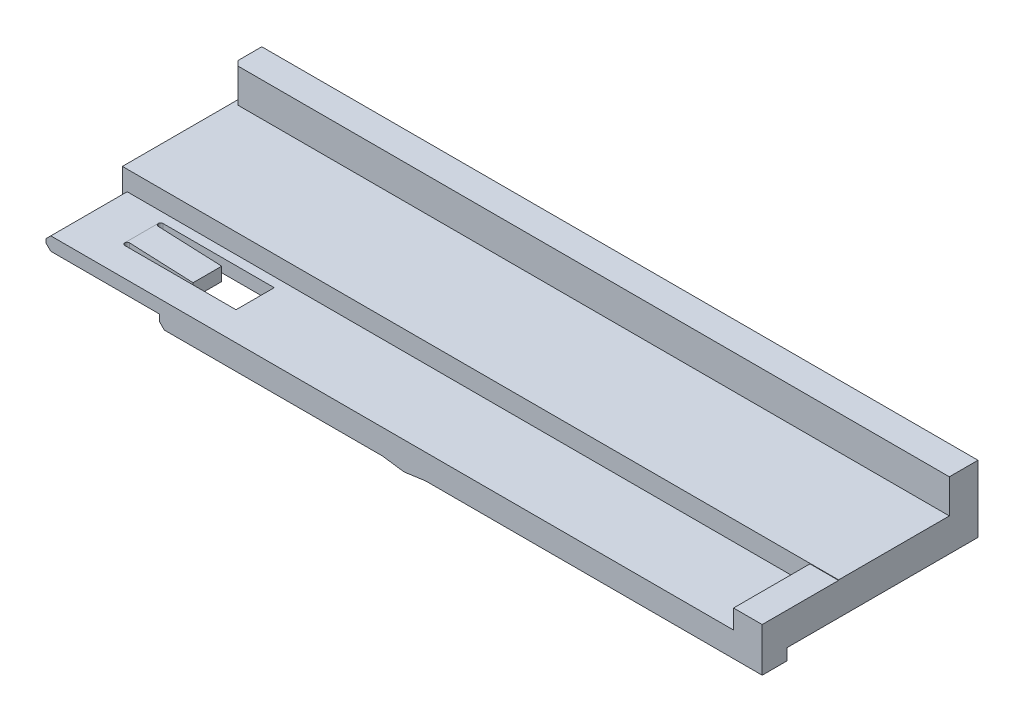
ISO-10303-21;
HEADER;
FILE_DESCRIPTION(('STEP AP214'),'2;1');
FILE_NAME('part.step','',(''),(''),'','','');
FILE_SCHEMA(('AUTOMOTIVE_DESIGN { 1 0 10303 214 1 1 1 1 }'));
ENDSEC;
DATA;
#1=APPLICATION_CONTEXT('core data for automotive mechanical design processes');
#2=APPLICATION_PROTOCOL_DEFINITION('international standard','automotive_design',2000,#1);
#3=PRODUCT_CONTEXT('',#1,'mechanical');
#4=PRODUCT('Part','Part','',(#3));
#5=PRODUCT_RELATED_PRODUCT_CATEGORY('part','',(#4));
#6=PRODUCT_DEFINITION_FORMATION('','',#4);
#7=PRODUCT_DEFINITION_CONTEXT('part definition',#1,'design');
#8=PRODUCT_DEFINITION('design','',#6,#7);
#9=PRODUCT_DEFINITION_SHAPE('','',#8);
#10=(LENGTH_UNIT() NAMED_UNIT(*) SI_UNIT(.MILLI.,.METRE.));
#11=(NAMED_UNIT(*) PLANE_ANGLE_UNIT() SI_UNIT($,.RADIAN.));
#12=(NAMED_UNIT(*) SI_UNIT($,.STERADIAN.) SOLID_ANGLE_UNIT());
#13=UNCERTAINTY_MEASURE_WITH_UNIT(LENGTH_MEASURE(1.E-05),#10,'distance_accuracy_value','');
#14=(GEOMETRIC_REPRESENTATION_CONTEXT(3) GLOBAL_UNCERTAINTY_ASSIGNED_CONTEXT((#13)) GLOBAL_UNIT_ASSIGNED_CONTEXT((#10,
#11,#12)) REPRESENTATION_CONTEXT('',''));
#15=CARTESIAN_POINT('',(0.,0.,0.));
#16=DIRECTION('',(0.,0.,1.));
#17=DIRECTION('',(1.,0.,0.));
#18=AXIS2_PLACEMENT_3D('',#15,#16,#17);
#19=CARTESIAN_POINT('',(75.,0.,-2.6));
#20=DIRECTION('',(0.,1.,0.));
#21=DIRECTION('',(0.,0.,1.));
#22=AXIS2_PLACEMENT_3D('',#19,#20,#21);
#23=PLANE('',#22);
#24=DIRECTION('',(-1.,0.,0.));
#25=VECTOR('',#24,1.);
#26=CARTESIAN_POINT('',(75.,0.,-2.6));
#27=LINE('',#26,#25);
#28=CARTESIAN_POINT('',(35.2653890832847,0.,-2.6));
#29=VERTEX_POINT('',#28);
#30=CARTESIAN_POINT('',(12.4,0.,-2.6));
#31=VERTEX_POINT('',#30);
#32=EDGE_CURVE('E375',#29,#31,#27,.T.);
#33=ORIENTED_EDGE('',*,*,#32,.F.);
#34=DIRECTION('',(0.,0.,1.));
#35=VECTOR('',#34,1.);
#36=CARTESIAN_POINT('',(35.2653890832847,0.,0.));
#37=LINE('',#36,#35);
#38=CARTESIAN_POINT('',(35.2653890832847,0.,0.));
#39=VERTEX_POINT('',#38);
#40=EDGE_CURVE('E290',#29,#39,#37,.T.);
#41=ORIENTED_EDGE('',*,*,#40,.T.);
#42=DIRECTION('',(-1.,0.,0.));
#43=VECTOR('',#42,1.);
#44=CARTESIAN_POINT('',(75.,0.,0.));
#45=LINE('',#44,#43);
#46=CARTESIAN_POINT('',(12.4,0.,0.));
#47=VERTEX_POINT('',#46);
#48=EDGE_CURVE('E401',#39,#47,#45,.T.);
#49=ORIENTED_EDGE('',*,*,#48,.T.);
#50=DIRECTION('',(0.,0.,-1.));
#51=VECTOR('',#50,1.);
#52=CARTESIAN_POINT('',(12.4,0.,-2.6));
#53=LINE('',#52,#51);
#54=EDGE_CURVE('E340',#47,#31,#53,.T.);
#55=ORIENTED_EDGE('',*,*,#54,.T.);
#56=EDGE_LOOP('',(#33,#41,#49,#55));
#57=FACE_BOUND('',#56,.T.);
#58=ADVANCED_FACE('F39',(#57),#23,.F.);
#59=CARTESIAN_POINT('',(75.,1.2,-2.6));
#60=DIRECTION('',(0.,0.,1.));
#61=DIRECTION('',(1.,0.,0.));
#62=AXIS2_PLACEMENT_3D('',#59,#60,#61);
#63=PLANE('',#62);
#64=DIRECTION('',(-1.,0.,0.));
#65=VECTOR('',#64,1.);
#66=CARTESIAN_POINT('',(75.,1.2,-2.6));
#67=LINE('',#66,#65);
#68=CARTESIAN_POINT('',(35.2653890832847,1.2,-2.6));
#69=VERTEX_POINT('',#68);
#70=CARTESIAN_POINT('',(11.9,1.2,-2.6));
#71=VERTEX_POINT('',#70);
#72=EDGE_CURVE('E378',#69,#71,#67,.T.);
#73=ORIENTED_EDGE('',*,*,#72,.F.);
#74=DIRECTION('',(0.,-1.,0.));
#75=VECTOR('',#74,1.);
#76=CARTESIAN_POINT('',(35.2653890832847,0.,-2.6));
#77=LINE('',#76,#75);
#78=EDGE_CURVE('E294',#69,#29,#77,.T.);
#79=ORIENTED_EDGE('',*,*,#78,.T.);
#80=ORIENTED_EDGE('',*,*,#32,.T.);
#81=DIRECTION('',(0.707106781186552,-0.707106781186543,0.));
#82=VECTOR('',#81,1.);
#83=CARTESIAN_POINT('',(11.9,0.499999999999994,-2.6));
#84=LINE('',#83,#82);
#85=CARTESIAN_POINT('',(11.9,0.499999999999994,-2.6));
#86=VERTEX_POINT('',#85);
#87=EDGE_CURVE('E338',#31,#86,#84,.F.);
#88=ORIENTED_EDGE('',*,*,#87,.T.);
#89=DIRECTION('',(0.,1.,0.));
#90=VECTOR('',#89,1.);
#91=CARTESIAN_POINT('',(11.9,1.2,-2.6));
#92=LINE('',#91,#90);
#93=EDGE_CURVE('E487',#86,#71,#92,.T.);
#94=ORIENTED_EDGE('',*,*,#93,.T.);
#95=EDGE_LOOP('',(#73,#79,#80,#88,#94));
#96=FACE_BOUND('',#95,.T.);
#97=ADVANCED_FACE('F539',(#96),#63,.F.);
#98=CARTESIAN_POINT('',(75.,2.6,0.));
#99=DIRECTION('',(0.,-1.,0.));
#100=DIRECTION('',(0.,0.,-1.));
#101=AXIS2_PLACEMENT_3D('',#98,#99,#100);
#102=PLANE('',#101);
#103=DIRECTION('',(0.,0.,-1.));
#104=VECTOR('',#103,1.);
#105=CARTESIAN_POINT('',(5.,2.6,-3.5));
#106=LINE('',#105,#104);
#107=CARTESIAN_POINT('',(5.,2.6,-3.25));
#108=VERTEX_POINT('',#107);
#109=CARTESIAN_POINT('',(5.,2.6,-6.75));
#110=VERTEX_POINT('',#109);
#111=EDGE_CURVE('E462',#108,#110,#106,.T.);
#112=ORIENTED_EDGE('',*,*,#111,.T.);
#113=CARTESIAN_POINT('',(5.25,2.6,-6.75));
#114=DIRECTION('',(0.,-1.,0.));
#115=DIRECTION('',(0.,0.,-1.));
#116=AXIS2_PLACEMENT_3D('',#113,#114,#115);
#117=CIRCLE('',#116,0.25);
#118=CARTESIAN_POINT('',(5.25,2.6,-7.));
#119=VERTEX_POINT('',#118);
#120=EDGE_CURVE('E321',#110,#119,#117,.T.);
#121=ORIENTED_EDGE('',*,*,#120,.T.);
#122=DIRECTION('',(1.,0.,0.));
#123=VECTOR('',#122,1.);
#124=CARTESIAN_POINT('',(5.,2.6,-7.));
#125=LINE('',#124,#123);
#126=CARTESIAN_POINT('',(16.9,2.6,-7.));
#127=VERTEX_POINT('',#126);
#128=EDGE_CURVE('E452',#119,#127,#125,.T.);
#129=ORIENTED_EDGE('',*,*,#128,.T.);
#130=DIRECTION('',(0.,0.,1.));
#131=VECTOR('',#130,1.);
#132=CARTESIAN_POINT('',(16.9,2.6,-7.));
#133=LINE('',#132,#131);
#134=CARTESIAN_POINT('',(16.9,2.6,-3.));
#135=VERTEX_POINT('',#134);
#136=EDGE_CURVE('E449',#127,#135,#133,.T.);
#137=ORIENTED_EDGE('',*,*,#136,.T.);
#138=DIRECTION('',(1.,0.,0.));
#139=VECTOR('',#138,1.);
#140=CARTESIAN_POINT('',(5.,2.6,-3.));
#141=LINE('',#140,#139);
#142=CARTESIAN_POINT('',(5.25,2.6,-3.));
#143=VERTEX_POINT('',#142);
#144=EDGE_CURVE('E447',#143,#135,#141,.T.);
#145=ORIENTED_EDGE('',*,*,#144,.F.);
#146=CARTESIAN_POINT('',(5.25,2.6,-3.25));
#147=DIRECTION('',(0.,-1.,0.));
#148=DIRECTION('',(0.,0.,-1.));
#149=AXIS2_PLACEMENT_3D('',#146,#147,#148);
#150=CIRCLE('',#149,0.25);
#151=EDGE_CURVE('E310',#143,#108,#150,.T.);
#152=ORIENTED_EDGE('',*,*,#151,.T.);
#153=EDGE_LOOP('',(#112,#121,#129,#137,#145,#152));
#154=FACE_BOUND('',#153,.T.);
#155=DIRECTION('',(-1.,0.,0.));
#156=VECTOR('',#155,1.);
#157=CARTESIAN_POINT('',(75.,2.6,-8.));
#158=LINE('',#157,#156);
#159=CARTESIAN_POINT('',(72.,2.6,-8.));
#160=VERTEX_POINT('',#159);
#161=CARTESIAN_POINT('',(0.499999999999987,2.6,-8.));
#162=VERTEX_POINT('',#161);
#163=EDGE_CURVE('E394',#160,#162,#158,.T.);
#164=ORIENTED_EDGE('',*,*,#163,.T.);
#165=DIRECTION('',(0.,0.,1.));
#166=VECTOR('',#165,1.);
#167=CARTESIAN_POINT('',(0.499999999999987,2.6,0.));
#168=LINE('',#167,#166);
#169=CARTESIAN_POINT('',(0.499999999999987,2.6,0.));
#170=VERTEX_POINT('',#169);
#171=EDGE_CURVE('E358',#162,#170,#168,.T.);
#172=ORIENTED_EDGE('',*,*,#171,.T.);
#173=DIRECTION('',(-1.,0.,0.));
#174=VECTOR('',#173,1.);
#175=CARTESIAN_POINT('',(75.,2.6,0.));
#176=LINE('',#175,#174);
#177=CARTESIAN_POINT('',(72.,2.6,0.));
#178=VERTEX_POINT('',#177);
#179=EDGE_CURVE('E397',#178,#170,#176,.T.);
#180=ORIENTED_EDGE('',*,*,#179,.F.);
#181=DIRECTION('',(0.,0.,1.));
#182=VECTOR('',#181,1.);
#183=CARTESIAN_POINT('',(72.,2.6,-8.));
#184=LINE('',#183,#182);
#185=EDGE_CURVE('E483',#160,#178,#184,.T.);
#186=ORIENTED_EDGE('',*,*,#185,.F.);
#187=EDGE_LOOP('',(#164,#172,#180,#186));
#188=FACE_BOUND('',#187,.T.);
#189=ADVANCED_FACE('F549',(#154,#188),#102,.F.);
#190=CARTESIAN_POINT('',(75.,2.6,-8.));
#191=DIRECTION('',(0.,0.,-1.));
#192=DIRECTION('',(-1.,0.,0.));
#193=AXIS2_PLACEMENT_3D('',#190,#191,#192);
#194=PLANE('',#193);
#195=DIRECTION('',(0.,-1.,0.));
#196=VECTOR('',#195,1.);
#197=CARTESIAN_POINT('',(72.,4.6,-8.));
#198=LINE('',#197,#196);
#199=CARTESIAN_POINT('',(72.,4.6,-8.));
#200=VERTEX_POINT('',#199);
#201=EDGE_CURVE('E480',#200,#160,#198,.T.);
#202=ORIENTED_EDGE('',*,*,#201,.F.);
#203=DIRECTION('',(-1.,0.,0.));
#204=VECTOR('',#203,1.);
#205=CARTESIAN_POINT('',(72.,4.6,-8.));
#206=LINE('',#205,#204);
#207=CARTESIAN_POINT('',(75.,4.6,-8.));
#208=VERTEX_POINT('',#207);
#209=EDGE_CURVE('E482',#208,#200,#206,.T.);
#210=ORIENTED_EDGE('',*,*,#209,.F.);
#211=DIRECTION('',(0.,-1.,0.));
#212=VECTOR('',#211,1.);
#213=CARTESIAN_POINT('',(75.,2.6,-8.));
#214=LINE('',#213,#212);
#215=CARTESIAN_POINT('',(75.,4.65,-8.));
#216=VERTEX_POINT('',#215);
#217=EDGE_CURVE('E418',#216,#208,#214,.T.);
#218=ORIENTED_EDGE('',*,*,#217,.F.);
#219=DIRECTION('',(-1.,0.,0.));
#220=VECTOR('',#219,1.);
#221=CARTESIAN_POINT('',(75.,4.65,-8.));
#222=LINE('',#221,#220);
#223=CARTESIAN_POINT('',(0.,4.65,-8.));
#224=VERTEX_POINT('',#223);
#225=EDGE_CURVE('E391',#216,#224,#222,.T.);
#226=ORIENTED_EDGE('',*,*,#225,.T.);
#227=DIRECTION('',(0.,-1.,0.));
#228=VECTOR('',#227,1.);
#229=CARTESIAN_POINT('',(0.,2.6,-8.));
#230=LINE('',#229,#228);
#231=CARTESIAN_POINT('',(0.,2.1,-8.));
#232=VERTEX_POINT('',#231);
#233=EDGE_CURVE('E406',#224,#232,#230,.T.);
#234=ORIENTED_EDGE('',*,*,#233,.T.);
#235=DIRECTION('',(0.707106781186538,0.707106781186557,0.));
#236=VECTOR('',#235,1.);
#237=CARTESIAN_POINT('',(37.749999999999,39.85,-8.));
#238=LINE('',#237,#236);
#239=EDGE_CURVE('E333',#232,#162,#238,.T.);
#240=ORIENTED_EDGE('',*,*,#239,.T.);
#241=ORIENTED_EDGE('',*,*,#163,.F.);
#242=EDGE_LOOP('',(#202,#210,#218,#226,#234,#240,#241));
#243=FACE_BOUND('',#242,.T.);
#244=ADVANCED_FACE('F540',(#243),#194,.F.);
#245=CARTESIAN_POINT('',(75.,1.2,-22.6));
#246=DIRECTION('',(0.,1.,0.));
#247=DIRECTION('',(0.,0.,1.));
#248=AXIS2_PLACEMENT_3D('',#245,#246,#247);
#249=PLANE('',#248);
#250=DIRECTION('',(0.,0.,-1.));
#251=VECTOR('',#250,1.);
#252=CARTESIAN_POINT('',(5.,1.2,-3.5));
#253=LINE('',#252,#251);
#254=CARTESIAN_POINT('',(5.,1.2,-3.25));
#255=VERTEX_POINT('',#254);
#256=CARTESIAN_POINT('',(5.,1.2,-6.75));
#257=VERTEX_POINT('',#256);
#258=EDGE_CURVE('E454',#255,#257,#253,.T.);
#259=ORIENTED_EDGE('',*,*,#258,.F.);
#260=CARTESIAN_POINT('',(5.25,1.2,-3.25));
#261=DIRECTION('',(0.,1.,0.));
#262=DIRECTION('',(0.,0.,1.));
#263=AXIS2_PLACEMENT_3D('',#260,#261,#262);
#264=CIRCLE('',#263,0.25);
#265=CARTESIAN_POINT('',(5.25,1.2,-3.));
#266=VERTEX_POINT('',#265);
#267=EDGE_CURVE('E308',#255,#266,#264,.T.);
#268=ORIENTED_EDGE('',*,*,#267,.T.);
#269=DIRECTION('',(1.,0.,0.));
#270=VECTOR('',#269,1.);
#271=CARTESIAN_POINT('',(75.,1.2,-3.));
#272=LINE('',#271,#270);
#273=CARTESIAN_POINT('',(16.9,1.2,-3.));
#274=VERTEX_POINT('',#273);
#275=EDGE_CURVE('E439',#266,#274,#272,.T.);
#276=ORIENTED_EDGE('',*,*,#275,.T.);
#277=DIRECTION('',(0.,0.,1.));
#278=VECTOR('',#277,1.);
#279=CARTESIAN_POINT('',(16.9,1.2,-22.6));
#280=LINE('',#279,#278);
#281=CARTESIAN_POINT('',(16.9,1.2,-7.));
#282=VERTEX_POINT('',#281);
#283=EDGE_CURVE('E436',#282,#274,#280,.T.);
#284=ORIENTED_EDGE('',*,*,#283,.F.);
#285=DIRECTION('',(1.,0.,0.));
#286=VECTOR('',#285,1.);
#287=CARTESIAN_POINT('',(75.,1.2,-7.));
#288=LINE('',#287,#286);
#289=CARTESIAN_POINT('',(5.25,1.2,-7.));
#290=VERTEX_POINT('',#289);
#291=EDGE_CURVE('E415',#290,#282,#288,.T.);
#292=ORIENTED_EDGE('',*,*,#291,.F.);
#293=CARTESIAN_POINT('',(5.25,1.2,-6.75));
#294=DIRECTION('',(0.,1.,0.));
#295=DIRECTION('',(0.,0.,1.));
#296=AXIS2_PLACEMENT_3D('',#293,#294,#295);
#297=CIRCLE('',#296,0.25);
#298=EDGE_CURVE('E318',#290,#257,#297,.T.);
#299=ORIENTED_EDGE('',*,*,#298,.T.);
#300=EDGE_LOOP('',(#259,#268,#276,#284,#292,#299));
#301=FACE_BOUND('',#300,.T.);
#302=CARTESIAN_POINT('',(75.,1.2,-2.6));
#303=VERTEX_POINT('',#302);
#304=CARTESIAN_POINT('',(39.7346109167153,1.2,-2.6));
#305=VERTEX_POINT('',#304);
#306=EDGE_CURVE('E376',#303,#305,#67,.T.);
#307=ORIENTED_EDGE('',*,*,#306,.T.);
#308=DIRECTION('',(-0.990268068741571,0.,-0.139173100960062));
#309=VECTOR('',#308,1.);
#310=CARTESIAN_POINT('',(37.6,1.2,-2.9));
#311=LINE('',#310,#309);
#312=CARTESIAN_POINT('',(37.6,1.2,-2.9));
#313=VERTEX_POINT('',#312);
#314=EDGE_CURVE('E281',#305,#313,#311,.T.);
#315=ORIENTED_EDGE('',*,*,#314,.T.);
#316=DIRECTION('',(-1.,0.,0.));
#317=VECTOR('',#316,1.);
#318=CARTESIAN_POINT('',(37.6,1.2,-2.9));
#319=LINE('',#318,#317);
#320=CARTESIAN_POINT('',(37.4,1.2,-2.9));
#321=VERTEX_POINT('',#320);
#322=EDGE_CURVE('E506',#313,#321,#319,.T.);
#323=ORIENTED_EDGE('',*,*,#322,.T.);
#324=DIRECTION('',(0.990268068741571,0.,-0.139173100960062));
#325=VECTOR('',#324,1.);
#326=CARTESIAN_POINT('',(35.2653890832847,1.2,-2.6));
#327=LINE('',#326,#325);
#328=EDGE_CURVE('E292',#321,#69,#327,.F.);
#329=ORIENTED_EDGE('',*,*,#328,.T.);
#330=ORIENTED_EDGE('',*,*,#72,.T.);
#331=DIRECTION('',(0.,0.,1.));
#332=VECTOR('',#331,1.);
#333=CARTESIAN_POINT('',(11.9,1.2,-3.));
#334=LINE('',#333,#332);
#335=CARTESIAN_POINT('',(11.9,1.2,0.));
#336=VERTEX_POINT('',#335);
#337=EDGE_CURVE('E498',#71,#336,#334,.T.);
#338=ORIENTED_EDGE('',*,*,#337,.T.);
#339=DIRECTION('',(-1.,0.,0.));
#340=VECTOR('',#339,1.);
#341=CARTESIAN_POINT('',(0.,1.2,0.));
#342=LINE('',#341,#340);
#343=CARTESIAN_POINT('',(0.499999999999987,1.2,0.));
#344=VERTEX_POINT('',#343);
#345=EDGE_CURVE('E501',#336,#344,#342,.T.);
#346=ORIENTED_EDGE('',*,*,#345,.T.);
#347=DIRECTION('',(0.,0.,-1.));
#348=VECTOR('',#347,1.);
#349=CARTESIAN_POINT('',(0.499999999999987,1.2,-22.6));
#350=LINE('',#349,#348);
#351=CARTESIAN_POINT('',(0.499999999999987,1.2,-22.6));
#352=VERTEX_POINT('',#351);
#353=EDGE_CURVE('E348',#344,#352,#350,.T.);
#354=ORIENTED_EDGE('',*,*,#353,.T.);
#355=DIRECTION('',(-1.,0.,0.));
#356=VECTOR('',#355,1.);
#357=CARTESIAN_POINT('',(75.,1.2,-22.6));
#358=LINE('',#357,#356);
#359=CARTESIAN_POINT('',(75.,1.2,-22.6));
#360=VERTEX_POINT('',#359);
#361=EDGE_CURVE('E379',#360,#352,#358,.T.);
#362=ORIENTED_EDGE('',*,*,#361,.F.);
#363=DIRECTION('',(0.,0.,-1.));
#364=VECTOR('',#363,1.);
#365=CARTESIAN_POINT('',(75.,1.2,-22.6));
#366=LINE('',#365,#364);
#367=EDGE_CURVE('E429',#303,#360,#366,.T.);
#368=ORIENTED_EDGE('',*,*,#367,.F.);
#369=EDGE_LOOP('',(#307,#315,#323,#329,#330,#338,#346,#354,#362,#368));
#370=FACE_BOUND('',#369,.T.);
#371=ADVANCED_FACE('F521',(#301,#370),#249,.F.);
#372=CARTESIAN_POINT('',(75.,0.,0.));
#373=VERTEX_POINT('',#372);
#374=CARTESIAN_POINT('',(39.7346109167153,0.,0.));
#375=VERTEX_POINT('',#374);
#376=EDGE_CURVE('E399',#373,#375,#45,.T.);
#377=ORIENTED_EDGE('',*,*,#376,.T.);
#378=DIRECTION('',(0.,0.,-1.));
#379=VECTOR('',#378,1.);
#380=CARTESIAN_POINT('',(39.7346109167153,0.,-2.6));
#381=LINE('',#380,#379);
#382=CARTESIAN_POINT('',(39.7346109167153,0.,-2.6));
#383=VERTEX_POINT('',#382);
#384=EDGE_CURVE('E49',#375,#383,#381,.T.);
#385=ORIENTED_EDGE('',*,*,#384,.T.);
#386=CARTESIAN_POINT('',(75.,0.,-2.6));
#387=VERTEX_POINT('',#386);
#388=EDGE_CURVE('E373',#387,#383,#27,.T.);
#389=ORIENTED_EDGE('',*,*,#388,.F.);
#390=DIRECTION('',(0.,0.,-1.));
#391=VECTOR('',#390,1.);
#392=CARTESIAN_POINT('',(75.,0.,-2.6));
#393=LINE('',#392,#391);
#394=EDGE_CURVE('E405',#373,#387,#393,.T.);
#395=ORIENTED_EDGE('',*,*,#394,.F.);
#396=EDGE_LOOP('',(#377,#385,#389,#395));
#397=FACE_BOUND('',#396,.T.);
#398=ADVANCED_FACE('F530',(#397),#23,.F.);
#399=ORIENTED_EDGE('',*,*,#388,.T.);
#400=DIRECTION('',(0.,1.,0.));
#401=VECTOR('',#400,1.);
#402=CARTESIAN_POINT('',(39.7346109167153,1.2,-2.6));
#403=LINE('',#402,#401);
#404=EDGE_CURVE('E62',#383,#305,#403,.T.);
#405=ORIENTED_EDGE('',*,*,#404,.T.);
#406=ORIENTED_EDGE('',*,*,#306,.F.);
#407=DIRECTION('',(0.,1.,0.));
#408=VECTOR('',#407,1.);
#409=CARTESIAN_POINT('',(75.,1.2,-2.6));
#410=LINE('',#409,#408);
#411=EDGE_CURVE('E431',#387,#303,#410,.T.);
#412=ORIENTED_EDGE('',*,*,#411,.F.);
#413=EDGE_LOOP('',(#399,#405,#406,#412));
#414=FACE_BOUND('',#413,.T.);
#415=ADVANCED_FACE('F525',(#414),#63,.F.);
#416=CARTESIAN_POINT('',(75.,8.2,-22.6));
#417=DIRECTION('',(0.,0.,1.));
#418=DIRECTION('',(0.,-1.,0.));
#419=AXIS2_PLACEMENT_3D('',#416,#417,#418);
#420=PLANE('',#419);
#421=ORIENTED_EDGE('',*,*,#361,.T.);
#422=DIRECTION('',(-0.707106781186538,0.707106781186557,0.));
#423=VECTOR('',#422,1.);
#424=CARTESIAN_POINT('',(0.499999999999987,1.2,-22.6));
#425=LINE('',#424,#423);
#426=CARTESIAN_POINT('',(0.,1.7,-22.6));
#427=VERTEX_POINT('',#426);
#428=EDGE_CURVE('E346',#352,#427,#425,.T.);
#429=ORIENTED_EDGE('',*,*,#428,.T.);
#430=DIRECTION('',(0.,1.,0.));
#431=VECTOR('',#430,1.);
#432=CARTESIAN_POINT('',(0.,8.2,-22.6));
#433=LINE('',#432,#431);
#434=CARTESIAN_POINT('',(0.,8.2,-22.6));
#435=VERTEX_POINT('',#434);
#436=EDGE_CURVE('E413',#427,#435,#433,.T.);
#437=ORIENTED_EDGE('',*,*,#436,.T.);
#438=DIRECTION('',(-1.,0.,0.));
#439=VECTOR('',#438,1.);
#440=CARTESIAN_POINT('',(75.,8.2,-22.6));
#441=LINE('',#440,#439);
#442=CARTESIAN_POINT('',(75.,8.2,-22.6));
#443=VERTEX_POINT('',#442);
#444=EDGE_CURVE('E382',#443,#435,#441,.T.);
#445=ORIENTED_EDGE('',*,*,#444,.F.);
#446=DIRECTION('',(0.,1.,0.));
#447=VECTOR('',#446,1.);
#448=CARTESIAN_POINT('',(75.,8.2,-22.6));
#449=LINE('',#448,#447);
#450=EDGE_CURVE('E427',#360,#443,#449,.T.);
#451=ORIENTED_EDGE('',*,*,#450,.F.);
#452=EDGE_LOOP('',(#421,#429,#437,#445,#451));
#453=FACE_BOUND('',#452,.T.);
#454=ADVANCED_FACE('F537',(#453),#420,.F.);
#455=CARTESIAN_POINT('',(75.,8.2,-19.6));
#456=DIRECTION('',(0.,-1.,0.));
#457=DIRECTION('',(0.,0.,-1.));
#458=AXIS2_PLACEMENT_3D('',#455,#456,#457);
#459=PLANE('',#458);
#460=DIRECTION('',(0.,0.,1.));
#461=VECTOR('',#460,1.);
#462=CARTESIAN_POINT('',(0.,8.2,-19.6));
#463=LINE('',#462,#461);
#464=CARTESIAN_POINT('',(0.,8.2,-20.1));
#465=VERTEX_POINT('',#464);
#466=EDGE_CURVE('E410',#435,#465,#463,.T.);
#467=ORIENTED_EDGE('',*,*,#466,.T.);
#468=DIRECTION('',(0.707106781186543,0.,0.707106781186552));
#469=VECTOR('',#468,1.);
#470=CARTESIAN_POINT('',(0.499999999999987,8.2,-19.6));
#471=LINE('',#470,#469);
#472=CARTESIAN_POINT('',(0.499999999999987,8.2,-19.6));
#473=VERTEX_POINT('',#472);
#474=EDGE_CURVE('E361',#465,#473,#471,.T.);
#475=ORIENTED_EDGE('',*,*,#474,.T.);
#476=DIRECTION('',(-1.,0.,0.));
#477=VECTOR('',#476,1.);
#478=CARTESIAN_POINT('',(75.,8.2,-19.6));
#479=LINE('',#478,#477);
#480=CARTESIAN_POINT('',(75.,8.2,-19.6));
#481=VERTEX_POINT('',#480);
#482=EDGE_CURVE('E385',#481,#473,#479,.T.);
#483=ORIENTED_EDGE('',*,*,#482,.F.);
#484=DIRECTION('',(0.,0.,1.));
#485=VECTOR('',#484,1.);
#486=CARTESIAN_POINT('',(75.,8.2,-19.6));
#487=LINE('',#486,#485);
#488=EDGE_CURVE('E425',#443,#481,#487,.T.);
#489=ORIENTED_EDGE('',*,*,#488,.F.);
#490=ORIENTED_EDGE('',*,*,#444,.T.);
#491=EDGE_LOOP('',(#467,#475,#483,#489,#490));
#492=FACE_BOUND('',#491,.T.);
#493=ADVANCED_FACE('F923',(#492),#459,.F.);
#494=CARTESIAN_POINT('',(75.,4.65,-19.6));
#495=DIRECTION('',(0.,0.,-1.));
#496=DIRECTION('',(-1.,0.,0.));
#497=AXIS2_PLACEMENT_3D('',#494,#495,#496);
#498=PLANE('',#497);
#499=ORIENTED_EDGE('',*,*,#482,.T.);
#500=DIRECTION('',(0.,-1.,0.));
#501=VECTOR('',#500,1.);
#502=CARTESIAN_POINT('',(0.499999999999987,4.65,-19.6));
#503=LINE('',#502,#501);
#504=CARTESIAN_POINT('',(0.499999999999987,4.65,-19.6));
#505=VERTEX_POINT('',#504);
#506=EDGE_CURVE('E370',#473,#505,#503,.T.);
#507=ORIENTED_EDGE('',*,*,#506,.T.);
#508=DIRECTION('',(-1.,0.,0.));
#509=VECTOR('',#508,1.);
#510=CARTESIAN_POINT('',(75.,4.65,-19.6));
#511=LINE('',#510,#509);
#512=CARTESIAN_POINT('',(75.,4.65,-19.6));
#513=VERTEX_POINT('',#512);
#514=EDGE_CURVE('E388',#513,#505,#511,.T.);
#515=ORIENTED_EDGE('',*,*,#514,.F.);
#516=DIRECTION('',(0.,-1.,0.));
#517=VECTOR('',#516,1.);
#518=CARTESIAN_POINT('',(75.,4.65,-19.6));
#519=LINE('',#518,#517);
#520=EDGE_CURVE('E423',#481,#513,#519,.T.);
#521=ORIENTED_EDGE('',*,*,#520,.F.);
#522=EDGE_LOOP('',(#499,#507,#515,#521));
#523=FACE_BOUND('',#522,.T.);
#524=ADVANCED_FACE('F913',(#523),#498,.F.);
#525=CARTESIAN_POINT('',(75.,4.65,-8.));
#526=DIRECTION('',(0.,-1.,0.));
#527=DIRECTION('',(0.,0.,-1.));
#528=AXIS2_PLACEMENT_3D('',#525,#526,#527);
#529=PLANE('',#528);
#530=DIRECTION('',(0.,0.,1.));
#531=VECTOR('',#530,1.);
#532=CARTESIAN_POINT('',(0.,4.65,-8.));
#533=LINE('',#532,#531);
#534=CARTESIAN_POINT('',(0.,4.65,-20.1));
#535=VERTEX_POINT('',#534);
#536=EDGE_CURVE('E408',#535,#224,#533,.T.);
#537=ORIENTED_EDGE('',*,*,#536,.T.);
#538=ORIENTED_EDGE('',*,*,#225,.F.);
#539=DIRECTION('',(0.,0.,1.));
#540=VECTOR('',#539,1.);
#541=CARTESIAN_POINT('',(75.,4.65,-8.));
#542=LINE('',#541,#540);
#543=EDGE_CURVE('E421',#513,#216,#542,.T.);
#544=ORIENTED_EDGE('',*,*,#543,.F.);
#545=ORIENTED_EDGE('',*,*,#514,.T.);
#546=DIRECTION('',(-0.707106781186543,0.,-0.707106781186552));
#547=VECTOR('',#546,1.);
#548=CARTESIAN_POINT('',(43.5499999999995,4.65,23.4500000000001));
#549=LINE('',#548,#547);
#550=EDGE_CURVE('E335',#505,#535,#549,.T.);
#551=ORIENTED_EDGE('',*,*,#550,.T.);
#552=EDGE_LOOP('',(#537,#538,#544,#545,#551));
#553=FACE_BOUND('',#552,.T.);
#554=ADVANCED_FACE('F627',(#553),#529,.F.);
#555=CARTESIAN_POINT('',(75.,0.,0.));
#556=DIRECTION('',(0.,0.,-1.));
#557=DIRECTION('',(-1.,0.,0.));
#558=AXIS2_PLACEMENT_3D('',#555,#556,#557);
#559=PLANE('',#558);
#560=ORIENTED_EDGE('',*,*,#179,.T.);
#561=DIRECTION('',(-0.707106781186538,-0.707106781186557,0.));
#562=VECTOR('',#561,1.);
#563=CARTESIAN_POINT('',(0.499999999999987,2.6,0.));
#564=LINE('',#563,#562);
#565=CARTESIAN_POINT('',(0.,2.1,0.));
#566=VERTEX_POINT('',#565);
#567=EDGE_CURVE('E351',#170,#566,#564,.T.);
#568=ORIENTED_EDGE('',*,*,#567,.T.);
#569=DIRECTION('',(0.,-1.,0.));
#570=VECTOR('',#569,1.);
#571=CARTESIAN_POINT('',(0.,0.,0.));
#572=LINE('',#571,#570);
#573=CARTESIAN_POINT('',(0.,1.7,0.));
#574=VERTEX_POINT('',#573);
#575=EDGE_CURVE('E402',#566,#574,#572,.T.);
#576=ORIENTED_EDGE('',*,*,#575,.T.);
#577=DIRECTION('',(0.707106781186538,-0.707106781186557,0.));
#578=VECTOR('',#577,1.);
#579=CARTESIAN_POINT('',(0.499999999999985,1.2,0.));
#580=LINE('',#579,#578);
#581=EDGE_CURVE('E353',#574,#344,#580,.T.);
#582=ORIENTED_EDGE('',*,*,#581,.T.);
#583=ORIENTED_EDGE('',*,*,#345,.F.);
#584=DIRECTION('',(0.,1.,0.));
#585=VECTOR('',#584,1.);
#586=CARTESIAN_POINT('',(11.9,0.,0.));
#587=LINE('',#586,#585);
#588=CARTESIAN_POINT('',(11.9,0.499999999999994,0.));
#589=VERTEX_POINT('',#588);
#590=EDGE_CURVE('E303',#589,#336,#587,.T.);
#591=ORIENTED_EDGE('',*,*,#590,.F.);
#592=DIRECTION('',(-0.707106781186552,0.707106781186543,0.));
#593=VECTOR('',#592,1.);
#594=CARTESIAN_POINT('',(11.9,0.499999999999994,0.));
#595=LINE('',#594,#593);
#596=EDGE_CURVE('E355',#589,#47,#595,.F.);
#597=ORIENTED_EDGE('',*,*,#596,.T.);
#598=ORIENTED_EDGE('',*,*,#48,.F.);
#599=DIRECTION('',(-0.990268068741571,0.139173100960062,0.));
#600=VECTOR('',#599,1.);
#601=CARTESIAN_POINT('',(74.2303742802679,-5.47617154375022,0.));
#602=LINE('',#601,#600);
#603=CARTESIAN_POINT('',(37.4,-0.3,0.));
#604=VERTEX_POINT('',#603);
#605=EDGE_CURVE('E261',#39,#604,#602,.F.);
#606=ORIENTED_EDGE('',*,*,#605,.T.);
#607=DIRECTION('',(-1.,0.,0.));
#608=VECTOR('',#607,1.);
#609=CARTESIAN_POINT('',(37.6,-0.3,0.));
#610=LINE('',#609,#608);
#611=CARTESIAN_POINT('',(37.6,-0.3,0.));
#612=VERTEX_POINT('',#611);
#613=EDGE_CURVE('E255',#612,#604,#610,.T.);
#614=ORIENTED_EDGE('',*,*,#613,.F.);
#615=DIRECTION('',(0.990268068741571,0.139173100960062,0.));
#616=VECTOR('',#615,1.);
#617=CARTESIAN_POINT('',(74.3169393174191,4.86022929938703,0.));
#618=LINE('',#617,#616);
#619=EDGE_CURVE('E11',#612,#375,#618,.T.);
#620=ORIENTED_EDGE('',*,*,#619,.T.);
#621=ORIENTED_EDGE('',*,*,#376,.F.);
#622=DIRECTION('',(0.,-1.,0.));
#623=VECTOR('',#622,1.);
#624=CARTESIAN_POINT('',(75.,0.,0.));
#625=LINE('',#624,#623);
#626=CARTESIAN_POINT('',(75.,4.6,0.));
#627=VERTEX_POINT('',#626);
#628=EDGE_CURVE('E416',#627,#373,#625,.T.);
#629=ORIENTED_EDGE('',*,*,#628,.F.);
#630=DIRECTION('',(1.,0.,0.));
#631=VECTOR('',#630,1.);
#632=CARTESIAN_POINT('',(72.,4.6,0.));
#633=LINE('',#632,#631);
#634=CARTESIAN_POINT('',(72.,4.6,0.));
#635=VERTEX_POINT('',#634);
#636=EDGE_CURVE('E491',#635,#627,#633,.T.);
#637=ORIENTED_EDGE('',*,*,#636,.F.);
#638=DIRECTION('',(0.,-1.,0.));
#639=VECTOR('',#638,1.);
#640=CARTESIAN_POINT('',(72.,4.6,0.));
#641=LINE('',#640,#639);
#642=EDGE_CURVE('E473',#635,#178,#641,.T.);
#643=ORIENTED_EDGE('',*,*,#642,.T.);
#644=EDGE_LOOP('',(#560,#568,#576,#582,#583,#591,#597,#598,#606,#614,#620,#621,#629,#637,#643));
#645=FACE_BOUND('',#644,.T.);
#646=ADVANCED_FACE('F258',(#645),#559,.F.);
#647=CARTESIAN_POINT('',(75.,0.,0.));
#648=DIRECTION('',(-1.,0.,0.));
#649=DIRECTION('',(0.,0.,1.));
#650=AXIS2_PLACEMENT_3D('',#647,#648,#649);
#651=PLANE('',#650);
#652=ORIENTED_EDGE('',*,*,#394,.T.);
#653=ORIENTED_EDGE('',*,*,#411,.T.);
#654=ORIENTED_EDGE('',*,*,#367,.T.);
#655=ORIENTED_EDGE('',*,*,#450,.T.);
#656=ORIENTED_EDGE('',*,*,#488,.T.);
#657=ORIENTED_EDGE('',*,*,#520,.T.);
#658=ORIENTED_EDGE('',*,*,#543,.T.);
#659=ORIENTED_EDGE('',*,*,#217,.T.);
#660=DIRECTION('',(0.,0.,-1.));
#661=VECTOR('',#660,1.);
#662=CARTESIAN_POINT('',(75.,4.6,-8.));
#663=LINE('',#662,#661);
#664=EDGE_CURVE('E489',#627,#208,#663,.T.);
#665=ORIENTED_EDGE('',*,*,#664,.F.);
#666=ORIENTED_EDGE('',*,*,#628,.T.);
#667=EDGE_LOOP('',(#652,#653,#654,#655,#656,#657,#658,#659,#665,#666));
#668=FACE_BOUND('',#667,.T.);
#669=ADVANCED_FACE('F528',(#668),#651,.F.);
#670=CARTESIAN_POINT('',(0.,0.,0.));
#671=DIRECTION('',(-1.,0.,0.));
#672=DIRECTION('',(0.,0.,1.));
#673=AXIS2_PLACEMENT_3D('',#670,#671,#672);
#674=PLANE('',#673);
#675=ORIENTED_EDGE('',*,*,#536,.F.);
#676=DIRECTION('',(0.,1.,0.));
#677=VECTOR('',#676,1.);
#678=CARTESIAN_POINT('',(0.,8.2,-20.1));
#679=LINE('',#678,#677);
#680=EDGE_CURVE('E363',#535,#465,#679,.T.);
#681=ORIENTED_EDGE('',*,*,#680,.T.);
#682=ORIENTED_EDGE('',*,*,#466,.F.);
#683=ORIENTED_EDGE('',*,*,#436,.F.);
#684=DIRECTION('',(0.,0.,1.));
#685=VECTOR('',#684,1.);
#686=CARTESIAN_POINT('',(0.,1.7,0.));
#687=LINE('',#686,#685);
#688=EDGE_CURVE('E368',#427,#574,#687,.T.);
#689=ORIENTED_EDGE('',*,*,#688,.T.);
#690=ORIENTED_EDGE('',*,*,#575,.F.);
#691=DIRECTION('',(0.,0.,-1.));
#692=VECTOR('',#691,1.);
#693=CARTESIAN_POINT('',(0.,2.1,-8.));
#694=LINE('',#693,#692);
#695=EDGE_CURVE('E365',#566,#232,#694,.T.);
#696=ORIENTED_EDGE('',*,*,#695,.T.);
#697=ORIENTED_EDGE('',*,*,#233,.F.);
#698=EDGE_LOOP('',(#675,#681,#682,#683,#689,#690,#696,#697));
#699=FACE_BOUND('',#698,.T.);
#700=ADVANCED_FACE('F879',(#699),#674,.T.);
#701=CARTESIAN_POINT('',(5.,-7.4,-7.));
#702=DIRECTION('',(0.,0.,1.));
#703=DIRECTION('',(1.,0.,0.));
#704=AXIS2_PLACEMENT_3D('',#701,#702,#703);
#705=PLANE('',#704);
#706=ORIENTED_EDGE('',*,*,#128,.F.);
#707=DIRECTION('',(0.,1.,0.));
#708=VECTOR('',#707,1.);
#709=CARTESIAN_POINT('',(5.25,-7.4,-7.));
#710=LINE('',#709,#708);
#711=EDGE_CURVE('E330',#119,#290,#710,.F.);
#712=ORIENTED_EDGE('',*,*,#711,.T.);
#713=ORIENTED_EDGE('',*,*,#291,.T.);
#714=DIRECTION('',(0.,1.,0.));
#715=VECTOR('',#714,1.);
#716=CARTESIAN_POINT('',(16.9,-7.4,-7.));
#717=LINE('',#716,#715);
#718=EDGE_CURVE('E441',#282,#127,#717,.T.);
#719=ORIENTED_EDGE('',*,*,#718,.T.);
#720=EDGE_LOOP('',(#706,#712,#713,#719));
#721=FACE_BOUND('',#720,.T.);
#722=ADVANCED_FACE('F870',(#721),#705,.T.);
#723=CARTESIAN_POINT('',(16.9,-7.4,-7.));
#724=DIRECTION('',(-1.,0.,0.));
#725=DIRECTION('',(0.,0.,1.));
#726=AXIS2_PLACEMENT_3D('',#723,#724,#725);
#727=PLANE('',#726);
#728=ORIENTED_EDGE('',*,*,#283,.T.);
#729=DIRECTION('',(0.,1.,0.));
#730=VECTOR('',#729,1.);
#731=CARTESIAN_POINT('',(16.9,-7.4,-3.));
#732=LINE('',#731,#730);
#733=EDGE_CURVE('E444',#274,#135,#732,.T.);
#734=ORIENTED_EDGE('',*,*,#733,.T.);
#735=ORIENTED_EDGE('',*,*,#136,.F.);
#736=ORIENTED_EDGE('',*,*,#718,.F.);
#737=EDGE_LOOP('',(#728,#734,#735,#736));
#738=FACE_BOUND('',#737,.T.);
#739=ADVANCED_FACE('F860',(#738),#727,.T.);
#740=CARTESIAN_POINT('',(5.,-7.4,-3.));
#741=DIRECTION('',(0.,0.,1.));
#742=DIRECTION('',(1.,0.,0.));
#743=AXIS2_PLACEMENT_3D('',#740,#741,#742);
#744=PLANE('',#743);
#745=ORIENTED_EDGE('',*,*,#275,.F.);
#746=DIRECTION('',(0.,1.,0.));
#747=VECTOR('',#746,1.);
#748=CARTESIAN_POINT('',(5.25,2.6,-3.));
#749=LINE('',#748,#747);
#750=EDGE_CURVE('E325',#266,#143,#749,.T.);
#751=ORIENTED_EDGE('',*,*,#750,.T.);
#752=ORIENTED_EDGE('',*,*,#144,.T.);
#753=ORIENTED_EDGE('',*,*,#733,.F.);
#754=EDGE_LOOP('',(#745,#751,#752,#753));
#755=FACE_BOUND('',#754,.T.);
#756=ADVANCED_FACE('F850',(#755),#744,.F.);
#757=CARTESIAN_POINT('',(5.,1.2,-3.5));
#758=DIRECTION('',(0.043437224276307,0.999056158355059,0.));
#759=DIRECTION('',(-0.99905615835506,0.043437224276307,0.));
#760=AXIS2_PLACEMENT_3D('',#757,#758,#759);
#761=PLANE('',#760);
#762=ORIENTED_EDGE('',*,*,#258,.T.);
#763=CARTESIAN_POINT('',(5.25,1.18913043478261,-6.75));
#764=DIRECTION('',(0.043437224276307,0.999056158355059,0.));
#765=DIRECTION('',(-0.99905615835506,0.043437224276307,0.));
#766=AXIS2_PLACEMENT_3D('',#763,#764,#765);
#767=ELLIPSE('',#766,0.250236183330899,0.25);
#768=CARTESIAN_POINT('',(5.25,1.18913043478261,-6.5));
#769=VERTEX_POINT('',#768);
#770=EDGE_CURVE('E316',#257,#769,#767,.T.);
#771=ORIENTED_EDGE('',*,*,#770,.T.);
#772=DIRECTION('',(0.99905615835506,-0.043437224276307,0.));
#773=VECTOR('',#772,1.);
#774=CARTESIAN_POINT('',(5.,1.2,-6.5));
#775=LINE('',#774,#773);
#776=CARTESIAN_POINT('',(11.9,0.899999999999998,-6.5));
#777=VERTEX_POINT('',#776);
#778=EDGE_CURVE('E471',#769,#777,#775,.T.);
#779=ORIENTED_EDGE('',*,*,#778,.T.);
#780=DIRECTION('',(0.,0.,-1.));
#781=VECTOR('',#780,1.);
#782=CARTESIAN_POINT('',(11.9,0.899999999999998,-3.5));
#783=LINE('',#782,#781);
#784=CARTESIAN_POINT('',(11.9,0.899999999999998,-3.5));
#785=VERTEX_POINT('',#784);
#786=EDGE_CURVE('E456',#785,#777,#783,.T.);
#787=ORIENTED_EDGE('',*,*,#786,.F.);
#788=DIRECTION('',(0.99905615835506,-0.043437224276307,0.));
#789=VECTOR('',#788,1.);
#790=CARTESIAN_POINT('',(5.,1.2,-3.5));
#791=LINE('',#790,#789);
#792=CARTESIAN_POINT('',(5.25,1.18913043478261,-3.5));
#793=VERTEX_POINT('',#792);
#794=EDGE_CURVE('E468',#793,#785,#791,.T.);
#795=ORIENTED_EDGE('',*,*,#794,.F.);
#796=CARTESIAN_POINT('',(5.25,1.18913043478261,-3.25));
#797=DIRECTION('',(0.043437224276307,0.999056158355059,0.));
#798=DIRECTION('',(0.99905615835506,-0.043437224276307,0.));
#799=AXIS2_PLACEMENT_3D('',#796,#797,#798);
#800=ELLIPSE('',#799,0.250236183330899,0.25);
#801=EDGE_CURVE('E305',#793,#255,#800,.T.);
#802=ORIENTED_EDGE('',*,*,#801,.T.);
#803=EDGE_LOOP('',(#762,#771,#779,#787,#795,#802));
#804=FACE_BOUND('',#803,.T.);
#805=ADVANCED_FACE('F840',(#804),#761,.F.);
#806=CARTESIAN_POINT('',(11.9,2.3,-3.5));
#807=DIRECTION('',(-1.,0.,0.));
#808=DIRECTION('',(0.,0.,1.));
#809=AXIS2_PLACEMENT_3D('',#806,#807,#808);
#810=PLANE('',#809);
#811=DIRECTION('',(0.,1.,0.));
#812=VECTOR('',#811,1.);
#813=CARTESIAN_POINT('',(11.9,2.3,-6.5));
#814=LINE('',#813,#812);
#815=CARTESIAN_POINT('',(11.9,2.3,-6.5));
#816=VERTEX_POINT('',#815);
#817=EDGE_CURVE('E469',#777,#816,#814,.T.);
#818=ORIENTED_EDGE('',*,*,#817,.T.);
#819=DIRECTION('',(0.,0.,-1.));
#820=VECTOR('',#819,1.);
#821=CARTESIAN_POINT('',(11.9,2.3,-3.5));
#822=LINE('',#821,#820);
#823=CARTESIAN_POINT('',(11.9,2.3,-3.5));
#824=VERTEX_POINT('',#823);
#825=EDGE_CURVE('E459',#824,#816,#822,.T.);
#826=ORIENTED_EDGE('',*,*,#825,.F.);
#827=DIRECTION('',(0.,1.,0.));
#828=VECTOR('',#827,1.);
#829=CARTESIAN_POINT('',(11.9,2.3,-3.5));
#830=LINE('',#829,#828);
#831=EDGE_CURVE('E476',#785,#824,#830,.T.);
#832=ORIENTED_EDGE('',*,*,#831,.F.);
#833=ORIENTED_EDGE('',*,*,#786,.T.);
#834=EDGE_LOOP('',(#818,#826,#832,#833));
#835=FACE_BOUND('',#834,.T.);
#836=ADVANCED_FACE('F830',(#835),#810,.F.);
#837=CARTESIAN_POINT('',(5.,2.6,-3.5));
#838=DIRECTION('',(-0.043437224276307,-0.999056158355059,0.));
#839=DIRECTION('',(0.99905615835506,-0.043437224276307,0.));
#840=AXIS2_PLACEMENT_3D('',#837,#838,#839);
#841=PLANE('',#840);
#842=DIRECTION('',(-0.99905615835506,0.043437224276307,0.));
#843=VECTOR('',#842,1.);
#844=CARTESIAN_POINT('',(5.,2.6,-6.5));
#845=LINE('',#844,#843);
#846=CARTESIAN_POINT('',(5.25,2.58913043478261,-6.5));
#847=VERTEX_POINT('',#846);
#848=EDGE_CURVE('E465',#816,#847,#845,.T.);
#849=ORIENTED_EDGE('',*,*,#848,.T.);
#850=CARTESIAN_POINT('',(5.25,2.58913043478261,-6.75));
#851=DIRECTION('',(-0.043437224276307,-0.999056158355059,0.));
#852=DIRECTION('',(-0.99905615835506,0.043437224276307,0.));
#853=AXIS2_PLACEMENT_3D('',#850,#851,#852);
#854=ELLIPSE('',#853,0.250236183330899,0.25);
#855=EDGE_CURVE('E313',#847,#110,#854,.T.);
#856=ORIENTED_EDGE('',*,*,#855,.T.);
#857=ORIENTED_EDGE('',*,*,#111,.F.);
#858=CARTESIAN_POINT('',(5.25,2.58913043478261,-3.25));
#859=DIRECTION('',(-0.043437224276307,-0.999056158355059,0.));
#860=DIRECTION('',(0.99905615835506,-0.043437224276307,0.));
#861=AXIS2_PLACEMENT_3D('',#858,#859,#860);
#862=ELLIPSE('',#861,0.250236183330899,0.25);
#863=CARTESIAN_POINT('',(5.25,2.58913043478261,-3.5));
#864=VERTEX_POINT('',#863);
#865=EDGE_CURVE('E297',#108,#864,#862,.T.);
#866=ORIENTED_EDGE('',*,*,#865,.T.);
#867=DIRECTION('',(-0.99905615835506,0.043437224276307,0.));
#868=VECTOR('',#867,1.);
#869=CARTESIAN_POINT('',(5.,2.6,-3.5));
#870=LINE('',#869,#868);
#871=EDGE_CURVE('E464',#824,#864,#870,.T.);
#872=ORIENTED_EDGE('',*,*,#871,.F.);
#873=ORIENTED_EDGE('',*,*,#825,.T.);
#874=EDGE_LOOP('',(#849,#856,#857,#866,#872,#873));
#875=FACE_BOUND('',#874,.T.);
#876=ADVANCED_FACE('F820',(#875),#841,.F.);
#877=CARTESIAN_POINT('',(0.,0.,-3.5));
#878=DIRECTION('',(0.,0.,1.));
#879=DIRECTION('',(1.,0.,0.));
#880=AXIS2_PLACEMENT_3D('',#877,#878,#879);
#881=PLANE('',#880);
#882=ORIENTED_EDGE('',*,*,#871,.T.);
#883=DIRECTION('',(0.,-1.,0.));
#884=VECTOR('',#883,1.);
#885=CARTESIAN_POINT('',(5.25,0.,-3.5));
#886=LINE('',#885,#884);
#887=EDGE_CURVE('E323',#864,#793,#886,.T.);
#888=ORIENTED_EDGE('',*,*,#887,.T.);
#889=ORIENTED_EDGE('',*,*,#794,.T.);
#890=ORIENTED_EDGE('',*,*,#831,.T.);
#891=EDGE_LOOP('',(#882,#888,#889,#890));
#892=FACE_BOUND('',#891,.T.);
#893=ADVANCED_FACE('F810',(#892),#881,.T.);
#894=CARTESIAN_POINT('',(0.,0.,-6.5));
#895=DIRECTION('',(0.,0.,1.));
#896=DIRECTION('',(1.,0.,0.));
#897=AXIS2_PLACEMENT_3D('',#894,#895,#896);
#898=PLANE('',#897);
#899=ORIENTED_EDGE('',*,*,#778,.F.);
#900=DIRECTION('',(0.,-1.,0.));
#901=VECTOR('',#900,1.);
#902=CARTESIAN_POINT('',(5.25,2.6,-6.5));
#903=LINE('',#902,#901);
#904=EDGE_CURVE('E328',#769,#847,#903,.F.);
#905=ORIENTED_EDGE('',*,*,#904,.T.);
#906=ORIENTED_EDGE('',*,*,#848,.F.);
#907=ORIENTED_EDGE('',*,*,#817,.F.);
#908=EDGE_LOOP('',(#899,#905,#906,#907));
#909=FACE_BOUND('',#908,.T.);
#910=ADVANCED_FACE('F780',(#909),#898,.F.);
#911=CARTESIAN_POINT('',(72.,4.6,-8.));
#912=DIRECTION('',(1.,0.,0.));
#913=DIRECTION('',(0.,0.,-1.));
#914=AXIS2_PLACEMENT_3D('',#911,#912,#913);
#915=PLANE('',#914);
#916=ORIENTED_EDGE('',*,*,#185,.T.);
#917=ORIENTED_EDGE('',*,*,#642,.F.);
#918=DIRECTION('',(0.,0.,1.));
#919=VECTOR('',#918,1.);
#920=CARTESIAN_POINT('',(72.,4.6,-8.));
#921=LINE('',#920,#919);
#922=EDGE_CURVE('E486',#200,#635,#921,.T.);
#923=ORIENTED_EDGE('',*,*,#922,.F.);
#924=ORIENTED_EDGE('',*,*,#201,.T.);
#925=EDGE_LOOP('',(#916,#917,#923,#924));
#926=FACE_BOUND('',#925,.T.);
#927=ADVANCED_FACE('F770',(#926),#915,.F.);
#928=CARTESIAN_POINT('',(0.,4.6,0.));
#929=DIRECTION('',(0.,1.,0.));
#930=DIRECTION('',(0.,0.,1.));
#931=AXIS2_PLACEMENT_3D('',#928,#929,#930);
#932=PLANE('',#931);
#933=ORIENTED_EDGE('',*,*,#922,.T.);
#934=ORIENTED_EDGE('',*,*,#636,.T.);
#935=ORIENTED_EDGE('',*,*,#664,.T.);
#936=ORIENTED_EDGE('',*,*,#209,.T.);
#937=EDGE_LOOP('',(#933,#934,#935,#936));
#938=FACE_BOUND('',#937,.T.);
#939=ADVANCED_FACE('F761',(#938),#932,.T.);
#940=CARTESIAN_POINT('',(11.9,0.,-3.));
#941=DIRECTION('',(1.,0.,0.));
#942=DIRECTION('',(0.,0.,-1.));
#943=AXIS2_PLACEMENT_3D('',#940,#941,#942);
#944=PLANE('',#943);
#945=ORIENTED_EDGE('',*,*,#93,.F.);
#946=DIRECTION('',(0.,0.,1.));
#947=VECTOR('',#946,1.);
#948=CARTESIAN_POINT('',(11.9,0.499999999999994,-3.));
#949=LINE('',#948,#947);
#950=EDGE_CURVE('E343',#86,#589,#949,.T.);
#951=ORIENTED_EDGE('',*,*,#950,.T.);
#952=ORIENTED_EDGE('',*,*,#590,.T.);
#953=ORIENTED_EDGE('',*,*,#337,.F.);
#954=EDGE_LOOP('',(#945,#951,#952,#953));
#955=FACE_BOUND('',#954,.T.);
#956=ADVANCED_FACE('F753',(#955),#944,.F.);
#957=CARTESIAN_POINT('',(0.499999999999987,4.65,-19.6));
#958=DIRECTION('',(-0.707106781186552,0.,0.707106781186543));
#959=DIRECTION('',(0.,1.,0.));
#960=AXIS2_PLACEMENT_3D('',#957,#958,#959);
#961=PLANE('',#960);
#962=ORIENTED_EDGE('',*,*,#474,.F.);
#963=ORIENTED_EDGE('',*,*,#680,.F.);
#964=ORIENTED_EDGE('',*,*,#550,.F.);
#965=ORIENTED_EDGE('',*,*,#506,.F.);
#966=EDGE_LOOP('',(#962,#963,#964,#965));
#967=FACE_BOUND('',#966,.T.);
#968=ADVANCED_FACE('F743',(#967),#961,.T.);
#969=CARTESIAN_POINT('',(0.499999999999987,2.6,0.));
#970=DIRECTION('',(-0.707106781186557,0.707106781186538,0.));
#971=DIRECTION('',(0.,0.,-1.));
#972=AXIS2_PLACEMENT_3D('',#969,#970,#971);
#973=PLANE('',#972);
#974=ORIENTED_EDGE('',*,*,#239,.F.);
#975=ORIENTED_EDGE('',*,*,#695,.F.);
#976=ORIENTED_EDGE('',*,*,#567,.F.);
#977=ORIENTED_EDGE('',*,*,#171,.F.);
#978=EDGE_LOOP('',(#974,#975,#976,#977));
#979=FACE_BOUND('',#978,.T.);
#980=ADVANCED_FACE('F733',(#979),#973,.T.);
#981=CARTESIAN_POINT('',(0.499999999999987,1.2,-22.6));
#982=DIRECTION('',(-0.707106781186557,-0.707106781186538,0.));
#983=DIRECTION('',(0.,0.,1.));
#984=AXIS2_PLACEMENT_3D('',#981,#982,#983);
#985=PLANE('',#984);
#986=ORIENTED_EDGE('',*,*,#581,.F.);
#987=ORIENTED_EDGE('',*,*,#688,.F.);
#988=ORIENTED_EDGE('',*,*,#428,.F.);
#989=ORIENTED_EDGE('',*,*,#353,.F.);
#990=EDGE_LOOP('',(#986,#987,#988,#989));
#991=FACE_BOUND('',#990,.T.);
#992=ADVANCED_FACE('F723',(#991),#985,.T.);
#993=CARTESIAN_POINT('',(11.9,0.499999999999994,-3.));
#994=DIRECTION('',(0.707106781186543,0.707106781186552,0.));
#995=DIRECTION('',(0.,0.,1.));
#996=AXIS2_PLACEMENT_3D('',#993,#994,#995);
#997=PLANE('',#996);
#998=ORIENTED_EDGE('',*,*,#87,.F.);
#999=ORIENTED_EDGE('',*,*,#54,.F.);
#1000=ORIENTED_EDGE('',*,*,#596,.F.);
#1001=ORIENTED_EDGE('',*,*,#950,.F.);
#1002=EDGE_LOOP('',(#998,#999,#1000,#1001));
#1003=FACE_BOUND('',#1002,.T.);
#1004=ADVANCED_FACE('F713',(#1003),#997,.F.);
#1005=CARTESIAN_POINT('',(5.25,-7.4,-6.75));
#1006=DIRECTION('',(0.,1.,0.));
#1007=DIRECTION('',(0.,0.,1.));
#1008=AXIS2_PLACEMENT_3D('',#1005,#1006,#1007);
#1009=CYLINDRICAL_SURFACE('',#1008,0.25);
#1010=ORIENTED_EDGE('',*,*,#904,.F.);
#1011=ORIENTED_EDGE('',*,*,#770,.F.);
#1012=DIRECTION('',(0.,-1.,0.));
#1013=VECTOR('',#1012,1.);
#1014=CARTESIAN_POINT('',(5.,1.2,-6.75));
#1015=LINE('',#1014,#1013);
#1016=EDGE_CURVE('E300',#110,#257,#1015,.T.);
#1017=ORIENTED_EDGE('',*,*,#1016,.F.);
#1018=ORIENTED_EDGE('',*,*,#855,.F.);
#1019=EDGE_LOOP('',(#1010,#1011,#1017,#1018));
#1020=FACE_BOUND('',#1019,.T.);
#1021=ADVANCED_FACE('F703',(#1020),#1009,.F.);
#1022=CARTESIAN_POINT('',(5.25,-7.4,-6.75));
#1023=DIRECTION('',(0.,1.,0.));
#1024=DIRECTION('',(0.,0.,1.));
#1025=AXIS2_PLACEMENT_3D('',#1022,#1023,#1024);
#1026=CYLINDRICAL_SURFACE('',#1025,0.25);
#1027=ORIENTED_EDGE('',*,*,#298,.F.);
#1028=ORIENTED_EDGE('',*,*,#711,.F.);
#1029=ORIENTED_EDGE('',*,*,#120,.F.);
#1030=ORIENTED_EDGE('',*,*,#1016,.T.);
#1031=EDGE_LOOP('',(#1027,#1028,#1029,#1030));
#1032=FACE_BOUND('',#1031,.T.);
#1033=ADVANCED_FACE('F694',(#1032),#1026,.F.);
#1034=CARTESIAN_POINT('',(5.25,0.,-3.25));
#1035=DIRECTION('',(0.,-1.,0.));
#1036=DIRECTION('',(0.,0.,-1.));
#1037=AXIS2_PLACEMENT_3D('',#1034,#1035,#1036);
#1038=CYLINDRICAL_SURFACE('',#1037,0.25);
#1039=DIRECTION('',(0.,-1.,0.));
#1040=VECTOR('',#1039,1.);
#1041=CARTESIAN_POINT('',(5.,-7.4,-3.25));
#1042=LINE('',#1041,#1040);
#1043=EDGE_CURVE('E264',#255,#108,#1042,.F.);
#1044=ORIENTED_EDGE('',*,*,#1043,.F.);
#1045=ORIENTED_EDGE('',*,*,#801,.F.);
#1046=ORIENTED_EDGE('',*,*,#887,.F.);
#1047=ORIENTED_EDGE('',*,*,#865,.F.);
#1048=EDGE_LOOP('',(#1044,#1045,#1046,#1047));
#1049=FACE_BOUND('',#1048,.T.);
#1050=ADVANCED_FACE('F685',(#1049),#1038,.F.);
#1051=CARTESIAN_POINT('',(5.25,-7.4,-3.25));
#1052=DIRECTION('',(0.,-1.,0.));
#1053=DIRECTION('',(0.,0.,-1.));
#1054=AXIS2_PLACEMENT_3D('',#1051,#1052,#1053);
#1055=CYLINDRICAL_SURFACE('',#1054,0.25);
#1056=ORIENTED_EDGE('',*,*,#267,.F.);
#1057=ORIENTED_EDGE('',*,*,#1043,.T.);
#1058=ORIENTED_EDGE('',*,*,#151,.F.);
#1059=ORIENTED_EDGE('',*,*,#750,.F.);
#1060=EDGE_LOOP('',(#1056,#1057,#1058,#1059));
#1061=FACE_BOUND('',#1060,.T.);
#1062=ADVANCED_FACE('F639',(#1061),#1055,.F.);
#1063=CARTESIAN_POINT('',(37.6,-0.3,0.));
#1064=DIRECTION('',(0.,1.,0.));
#1065=DIRECTION('',(0.,0.,1.));
#1066=AXIS2_PLACEMENT_3D('',#1063,#1064,#1065);
#1067=PLANE('',#1066);
#1068=DIRECTION('',(0.,0.,-1.));
#1069=VECTOR('',#1068,1.);
#1070=CARTESIAN_POINT('',(37.4,-0.3,0.));
#1071=LINE('',#1070,#1069);
#1072=CARTESIAN_POINT('',(37.4,-0.3,-2.9));
#1073=VERTEX_POINT('',#1072);
#1074=EDGE_CURVE('E288',#604,#1073,#1071,.T.);
#1075=ORIENTED_EDGE('',*,*,#1074,.T.);
#1076=DIRECTION('',(-1.,0.,0.));
#1077=VECTOR('',#1076,1.);
#1078=CARTESIAN_POINT('',(37.6,-0.3,-2.9));
#1079=LINE('',#1078,#1077);
#1080=CARTESIAN_POINT('',(37.6,-0.3,-2.9));
#1081=VERTEX_POINT('',#1080);
#1082=EDGE_CURVE('E265',#1081,#1073,#1079,.T.);
#1083=ORIENTED_EDGE('',*,*,#1082,.F.);
#1084=DIRECTION('',(0.,0.,-1.));
#1085=VECTOR('',#1084,1.);
#1086=CARTESIAN_POINT('',(37.6,-0.3,0.));
#1087=LINE('',#1086,#1085);
#1088=EDGE_CURVE('E269',#612,#1081,#1087,.T.);
#1089=ORIENTED_EDGE('',*,*,#1088,.F.);
#1090=ORIENTED_EDGE('',*,*,#613,.T.);
#1091=EDGE_LOOP('',(#1075,#1083,#1089,#1090));
#1092=FACE_BOUND('',#1091,.T.);
#1093=ADVANCED_FACE('F270',(#1092),#1067,.F.);
#1094=CARTESIAN_POINT('',(37.6,-0.3,-2.9));
#1095=DIRECTION('',(0.,0.,1.));
#1096=DIRECTION('',(1.,0.,0.));
#1097=AXIS2_PLACEMENT_3D('',#1094,#1095,#1096);
#1098=PLANE('',#1097);
#1099=DIRECTION('',(0.,1.,0.));
#1100=VECTOR('',#1099,1.);
#1101=CARTESIAN_POINT('',(37.4,-0.3,-2.9));
#1102=LINE('',#1101,#1100);
#1103=EDGE_CURVE('E276',#1073,#321,#1102,.T.);
#1104=ORIENTED_EDGE('',*,*,#1103,.T.);
#1105=ORIENTED_EDGE('',*,*,#322,.F.);
#1106=DIRECTION('',(0.,1.,0.));
#1107=VECTOR('',#1106,1.);
#1108=CARTESIAN_POINT('',(37.6,-0.3,-2.9));
#1109=LINE('',#1108,#1107);
#1110=EDGE_CURVE('E275',#1081,#313,#1109,.T.);
#1111=ORIENTED_EDGE('',*,*,#1110,.F.);
#1112=ORIENTED_EDGE('',*,*,#1082,.T.);
#1113=EDGE_LOOP('',(#1104,#1105,#1111,#1112));
#1114=FACE_BOUND('',#1113,.T.);
#1115=ADVANCED_FACE('F517',(#1114),#1098,.F.);
#1116=CARTESIAN_POINT('',(35.2653890832847,0.,-2.6));
#1117=DIRECTION('',(-0.139173100960062,-0.990268068741571,0.));
#1118=DIRECTION('',(0.,0.,-1.));
#1119=AXIS2_PLACEMENT_3D('',#1116,#1117,#1118);
#1120=PLANE('',#1119);
#1121=ORIENTED_EDGE('',*,*,#605,.F.);
#1122=ORIENTED_EDGE('',*,*,#40,.F.);
#1123=DIRECTION('',(0.98081484846399,-0.137844537491626,-0.137844537491626));
#1124=VECTOR('',#1123,1.);
#1125=CARTESIAN_POINT('',(35.2653890832847,0.,-2.6));
#1126=LINE('',#1125,#1124);
#1127=EDGE_CURVE('E286',#1073,#29,#1126,.F.);
#1128=ORIENTED_EDGE('',*,*,#1127,.F.);
#1129=ORIENTED_EDGE('',*,*,#1074,.F.);
#1130=EDGE_LOOP('',(#1121,#1122,#1128,#1129));
#1131=FACE_BOUND('',#1130,.T.);
#1132=ADVANCED_FACE('F561',(#1131),#1120,.T.);
#1133=CARTESIAN_POINT('',(35.2653890832847,1.2,-2.6));
#1134=DIRECTION('',(-0.139173100960062,0.,-0.990268068741571));
#1135=DIRECTION('',(0.,1.,0.));
#1136=AXIS2_PLACEMENT_3D('',#1133,#1134,#1135);
#1137=PLANE('',#1136);
#1138=ORIENTED_EDGE('',*,*,#328,.F.);
#1139=ORIENTED_EDGE('',*,*,#1103,.F.);
#1140=ORIENTED_EDGE('',*,*,#1127,.T.);
#1141=ORIENTED_EDGE('',*,*,#78,.F.);
#1142=EDGE_LOOP('',(#1138,#1139,#1140,#1141));
#1143=FACE_BOUND('',#1142,.T.);
#1144=ADVANCED_FACE('F558',(#1143),#1137,.T.);
#1145=CARTESIAN_POINT('',(37.6,-0.299999999999998,0.));
#1146=DIRECTION('',(-0.139173100960062,0.990268068741571,0.));
#1147=DIRECTION('',(0.,0.,1.));
#1148=AXIS2_PLACEMENT_3D('',#1145,#1146,#1147);
#1149=PLANE('',#1148);
#1150=ORIENTED_EDGE('',*,*,#619,.F.);
#1151=ORIENTED_EDGE('',*,*,#1088,.T.);
#1152=DIRECTION('',(0.98081484846399,0.137844537491626,0.137844537491626));
#1153=VECTOR('',#1152,1.);
#1154=CARTESIAN_POINT('',(37.9920799105392,-0.244896762102786,-2.84489676210278));
#1155=LINE('',#1154,#1153);
#1156=EDGE_CURVE('E44',#383,#1081,#1155,.F.);
#1157=ORIENTED_EDGE('',*,*,#1156,.F.);
#1158=ORIENTED_EDGE('',*,*,#384,.F.);
#1159=EDGE_LOOP('',(#1150,#1151,#1157,#1158));
#1160=FACE_BOUND('',#1159,.T.);
#1161=ADVANCED_FACE('F42',(#1160),#1149,.F.);
#1162=CARTESIAN_POINT('',(37.6,0.,-2.9));
#1163=DIRECTION('',(-0.139173100960062,0.,0.990268068741571));
#1164=DIRECTION('',(0.,-1.,0.));
#1165=AXIS2_PLACEMENT_3D('',#1162,#1163,#1164);
#1166=PLANE('',#1165);
#1167=ORIENTED_EDGE('',*,*,#314,.F.);
#1168=ORIENTED_EDGE('',*,*,#404,.F.);
#1169=ORIENTED_EDGE('',*,*,#1156,.T.);
#1170=ORIENTED_EDGE('',*,*,#1110,.T.);
#1171=EDGE_LOOP('',(#1167,#1168,#1169,#1170));
#1172=FACE_BOUND('',#1171,.T.);
#1173=ADVANCED_FACE('F514',(#1172),#1166,.F.);
#1174=CLOSED_SHELL('',(#58,#97,#189,#244,#371,#398,#415,#454,#493,#524,#554,#646,#669,#700,#722,
#739,#756,#805,#836,#876,#893,#910,#927,#939,#956,#968,#980,#992,#1004,#1021,#1033,#1050,#1062,
#1093,#1115,#1132,#1144,#1161,#1173));
#1175=MANIFOLD_SOLID_BREP('B2',#1174);
#1176=ADVANCED_BREP_SHAPE_REPRESENTATION('',(#18,#1175),#14);
#1177=SHAPE_DEFINITION_REPRESENTATION(#9,#1176);
ENDSEC;
END-ISO-10303-21;
